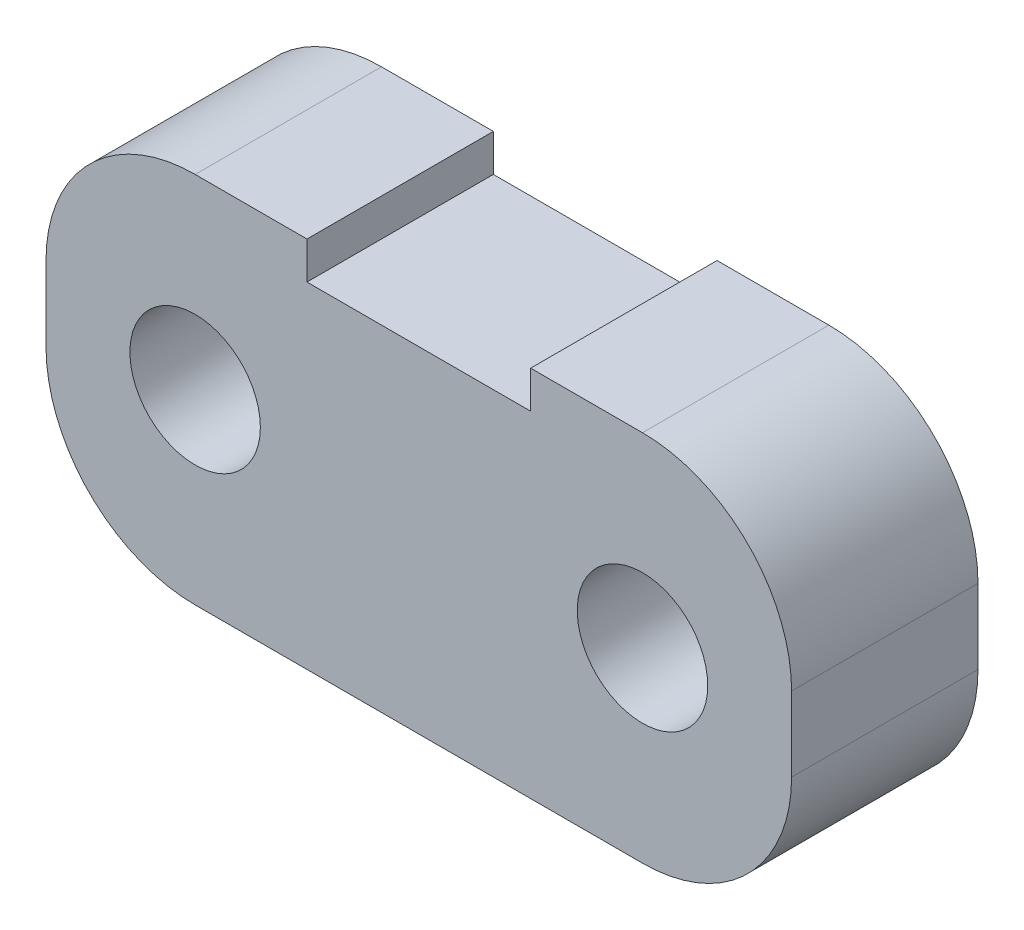
ISO-10303-21;
HEADER;
FILE_DESCRIPTION(('STEP AP214'),'2;1');
FILE_NAME('part.step','',(''),(''),'','','');
FILE_SCHEMA(('AUTOMOTIVE_DESIGN { 1 0 10303 214 1 1 1 1 }'));
ENDSEC;
DATA;
#1=APPLICATION_CONTEXT('core data for automotive mechanical design processes');
#2=APPLICATION_PROTOCOL_DEFINITION('international standard','automotive_design',2000,#1);
#3=PRODUCT_CONTEXT('',#1,'mechanical');
#4=PRODUCT('Part','Part','',(#3));
#5=PRODUCT_RELATED_PRODUCT_CATEGORY('part','',(#4));
#6=PRODUCT_DEFINITION_FORMATION('','',#4);
#7=PRODUCT_DEFINITION_CONTEXT('part definition',#1,'design');
#8=PRODUCT_DEFINITION('design','',#6,#7);
#9=PRODUCT_DEFINITION_SHAPE('','',#8);
#10=(LENGTH_UNIT() NAMED_UNIT(*) SI_UNIT(.MILLI.,.METRE.));
#11=(NAMED_UNIT(*) PLANE_ANGLE_UNIT() SI_UNIT($,.RADIAN.));
#12=(NAMED_UNIT(*) SI_UNIT($,.STERADIAN.) SOLID_ANGLE_UNIT());
#13=UNCERTAINTY_MEASURE_WITH_UNIT(LENGTH_MEASURE(1.E-05),#10,'distance_accuracy_value','');
#14=(GEOMETRIC_REPRESENTATION_CONTEXT(3) GLOBAL_UNCERTAINTY_ASSIGNED_CONTEXT((#13)) GLOBAL_UNIT_ASSIGNED_CONTEXT((#10,
#11,#12)) REPRESENTATION_CONTEXT('',''));
#15=CARTESIAN_POINT('',(0.,0.,0.));
#16=DIRECTION('',(0.,0.,1.));
#17=DIRECTION('',(1.,0.,0.));
#18=AXIS2_PLACEMENT_3D('',#15,#16,#17);
#19=CARTESIAN_POINT('',(6.,1.,0.));
#20=DIRECTION('',(0.,0.,-1.));
#21=DIRECTION('',(-1.,0.,0.));
#22=AXIS2_PLACEMENT_3D('',#19,#20,#21);
#23=PLANE('',#22);
#24=CARTESIAN_POINT('',(6.,0.,0.));
#25=DIRECTION('',(0.,0.,1.));
#26=DIRECTION('',(1.,0.,0.));
#27=AXIS2_PLACEMENT_3D('',#24,#25,#26);
#28=CIRCLE('',#27,1.75);
#29=CARTESIAN_POINT('',(7.75,0.,0.));
#30=VERTEX_POINT('',#29);
#31=EDGE_CURVE('E402',#30,#30,#28,.T.);
#32=ORIENTED_EDGE('',*,*,#31,.T.);
#33=EDGE_LOOP('',(#32));
#34=FACE_BOUND('',#33,.T.);
#35=CARTESIAN_POINT('',(6.,1.,0.));
#36=DIRECTION('',(0.,0.,1.));
#37=DIRECTION('',(-1.,0.,0.));
#38=AXIS2_PLACEMENT_3D('',#35,#36,#37);
#39=CIRCLE('',#38,4.);
#40=CARTESIAN_POINT('',(10.,1.,0.));
#41=VERTEX_POINT('',#40);
#42=CARTESIAN_POINT('',(6.,5.,0.));
#43=VERTEX_POINT('',#42);
#44=EDGE_CURVE('E249',#41,#43,#39,.T.);
#45=ORIENTED_EDGE('',*,*,#44,.F.);
#46=DIRECTION('',(0.,1.,0.));
#47=VECTOR('',#46,1.);
#48=CARTESIAN_POINT('',(10.,1.,0.));
#49=LINE('',#48,#47);
#50=CARTESIAN_POINT('',(10.,-1.,0.));
#51=VERTEX_POINT('',#50);
#52=EDGE_CURVE('E245',#51,#41,#49,.T.);
#53=ORIENTED_EDGE('',*,*,#52,.F.);
#54=CARTESIAN_POINT('',(6.,-1.,0.));
#55=DIRECTION('',(0.,0.,1.));
#56=DIRECTION('',(-1.,0.,0.));
#57=AXIS2_PLACEMENT_3D('',#54,#55,#56);
#58=CIRCLE('',#57,4.);
#59=CARTESIAN_POINT('',(6.,-5.,0.));
#60=VERTEX_POINT('',#59);
#61=EDGE_CURVE('E448',#60,#51,#58,.T.);
#62=ORIENTED_EDGE('',*,*,#61,.F.);
#63=DIRECTION('',(1.,0.,0.));
#64=VECTOR('',#63,1.);
#65=CARTESIAN_POINT('',(-6.,-5.,0.));
#66=LINE('',#65,#64);
#67=CARTESIAN_POINT('',(-6.,-5.,0.));
#68=VERTEX_POINT('',#67);
#69=EDGE_CURVE('E446',#68,#60,#66,.T.);
#70=ORIENTED_EDGE('',*,*,#69,.F.);
#71=CARTESIAN_POINT('',(-6.,-1.,0.));
#72=DIRECTION('',(0.,0.,1.));
#73=DIRECTION('',(-1.,0.,0.));
#74=AXIS2_PLACEMENT_3D('',#71,#72,#73);
#75=CIRCLE('',#74,4.);
#76=CARTESIAN_POINT('',(-10.,-1.,0.));
#77=VERTEX_POINT('',#76);
#78=EDGE_CURVE('E444',#77,#68,#75,.T.);
#79=ORIENTED_EDGE('',*,*,#78,.F.);
#80=DIRECTION('',(0.,-1.,0.));
#81=VECTOR('',#80,1.);
#82=CARTESIAN_POINT('',(-10.,1.,0.));
#83=LINE('',#82,#81);
#84=CARTESIAN_POINT('',(-10.,1.,0.));
#85=VERTEX_POINT('',#84);
#86=EDGE_CURVE('E442',#85,#77,#83,.T.);
#87=ORIENTED_EDGE('',*,*,#86,.F.);
#88=CARTESIAN_POINT('',(-6.,1.,0.));
#89=DIRECTION('',(0.,0.,1.));
#90=DIRECTION('',(-1.,0.,0.));
#91=AXIS2_PLACEMENT_3D('',#88,#89,#90);
#92=CIRCLE('',#91,4.);
#93=CARTESIAN_POINT('',(-6.,5.,0.));
#94=VERTEX_POINT('',#93);
#95=EDGE_CURVE('E440',#94,#85,#92,.T.);
#96=ORIENTED_EDGE('',*,*,#95,.F.);
#97=DIRECTION('',(-1.,0.,0.));
#98=VECTOR('',#97,1.);
#99=CARTESIAN_POINT('',(-6.,5.,0.));
#100=LINE('',#99,#98);
#101=CARTESIAN_POINT('',(-3.,5.,0.));
#102=VERTEX_POINT('',#101);
#103=EDGE_CURVE('E438',#102,#94,#100,.T.);
#104=ORIENTED_EDGE('',*,*,#103,.F.);
#105=DIRECTION('',(0.,1.,0.));
#106=VECTOR('',#105,1.);
#107=CARTESIAN_POINT('',(-3.,4.,0.));
#108=LINE('',#107,#106);
#109=CARTESIAN_POINT('',(-3.,4.,0.));
#110=VERTEX_POINT('',#109);
#111=EDGE_CURVE('E436',#110,#102,#108,.T.);
#112=ORIENTED_EDGE('',*,*,#111,.F.);
#113=DIRECTION('',(-1.,0.,0.));
#114=VECTOR('',#113,1.);
#115=CARTESIAN_POINT('',(-3.,4.,0.));
#116=LINE('',#115,#114);
#117=CARTESIAN_POINT('',(3.,4.,0.));
#118=VERTEX_POINT('',#117);
#119=EDGE_CURVE('E434',#118,#110,#116,.T.);
#120=ORIENTED_EDGE('',*,*,#119,.F.);
#121=DIRECTION('',(0.,-1.,0.));
#122=VECTOR('',#121,1.);
#123=CARTESIAN_POINT('',(3.,4.,0.));
#124=LINE('',#123,#122);
#125=CARTESIAN_POINT('',(3.,5.,0.));
#126=VERTEX_POINT('',#125);
#127=EDGE_CURVE('E432',#126,#118,#124,.T.);
#128=ORIENTED_EDGE('',*,*,#127,.F.);
#129=DIRECTION('',(-1.,0.,0.));
#130=VECTOR('',#129,1.);
#131=CARTESIAN_POINT('',(3.,5.,0.));
#132=LINE('',#131,#130);
#133=EDGE_CURVE('E430',#43,#126,#132,.T.);
#134=ORIENTED_EDGE('',*,*,#133,.F.);
#135=EDGE_LOOP('',(#45,#53,#62,#70,#79,#87,#96,#104,#112,#120,#128,#134));
#136=FACE_BOUND('',#135,.T.);
#137=CARTESIAN_POINT('',(-6.,0.,0.));
#138=DIRECTION('',(0.,0.,1.));
#139=DIRECTION('',(1.,0.,0.));
#140=AXIS2_PLACEMENT_3D('',#137,#138,#139);
#141=CIRCLE('',#140,1.75);
#142=CARTESIAN_POINT('',(-4.25,0.,0.));
#143=VERTEX_POINT('',#142);
#144=EDGE_CURVE('E398',#143,#143,#141,.T.);
#145=ORIENTED_EDGE('',*,*,#144,.T.);
#146=EDGE_LOOP('',(#145));
#147=FACE_BOUND('',#146,.T.);
#148=DIRECTION('',(0.,1.,0.));
#149=VECTOR('',#148,1.);
#150=CARTESIAN_POINT('',(-3.00000000000003,-3.,0.));
#151=LINE('',#150,#149);
#152=CARTESIAN_POINT('',(-3.00000000000005,-4.5,0.));
#153=VERTEX_POINT('',#152);
#154=CARTESIAN_POINT('',(-3.00000000000003,-2.5,0.));
#155=VERTEX_POINT('',#154);
#156=EDGE_CURVE('E377',#153,#155,#151,.T.);
#157=ORIENTED_EDGE('',*,*,#156,.F.);
#158=DIRECTION('',(-1.,0.,0.));
#159=VECTOR('',#158,1.);
#160=CARTESIAN_POINT('',(6.,-4.5,0.));
#161=LINE('',#160,#159);
#162=CARTESIAN_POINT('',(2.99999999999995,-4.5,0.));
#163=VERTEX_POINT('',#162);
#164=EDGE_CURVE('E253',#153,#163,#161,.F.);
#165=ORIENTED_EDGE('',*,*,#164,.T.);
#166=DIRECTION('',(0.,-1.,0.));
#167=VECTOR('',#166,1.);
#168=CARTESIAN_POINT('',(2.99999999999997,-3.,0.));
#169=LINE('',#168,#167);
#170=CARTESIAN_POINT('',(2.99999999999998,-2.5,0.));
#171=VERTEX_POINT('',#170);
#172=EDGE_CURVE('E372',#171,#163,#169,.T.);
#173=ORIENTED_EDGE('',*,*,#172,.F.);
#174=DIRECTION('',(0.,-1.,0.));
#175=VECTOR('',#174,1.);
#176=CARTESIAN_POINT('',(2.99999999999999,-1.,0.));
#177=LINE('',#176,#175);
#178=CARTESIAN_POINT('',(3.,-0.5,0.));
#179=VERTEX_POINT('',#178);
#180=EDGE_CURVE('E382',#179,#171,#177,.T.);
#181=ORIENTED_EDGE('',*,*,#180,.F.);
#182=DIRECTION('',(0.,-1.,0.));
#183=VECTOR('',#182,1.);
#184=CARTESIAN_POINT('',(3.,1.,0.));
#185=LINE('',#184,#183);
#186=CARTESIAN_POINT('',(3.,1.5,0.));
#187=VERTEX_POINT('',#186);
#188=EDGE_CURVE('E389',#187,#179,#185,.T.);
#189=ORIENTED_EDGE('',*,*,#188,.F.);
#190=DIRECTION('',(0.,-1.,0.));
#191=VECTOR('',#190,1.);
#192=CARTESIAN_POINT('',(3.,3.,0.));
#193=LINE('',#192,#191);
#194=CARTESIAN_POINT('',(3.,3.5,0.));
#195=VERTEX_POINT('',#194);
#196=EDGE_CURVE('E394',#195,#187,#193,.T.);
#197=ORIENTED_EDGE('',*,*,#196,.F.);
#198=DIRECTION('',(1.,0.,0.));
#199=VECTOR('',#198,1.);
#200=CARTESIAN_POINT('',(6.,3.5,0.));
#201=LINE('',#200,#199);
#202=CARTESIAN_POINT('',(-3.,3.5,0.));
#203=VERTEX_POINT('',#202);
#204=EDGE_CURVE('E250',#195,#203,#201,.F.);
#205=ORIENTED_EDGE('',*,*,#204,.T.);
#206=DIRECTION('',(0.,1.,0.));
#207=VECTOR('',#206,1.);
#208=CARTESIAN_POINT('',(-3.,3.,0.));
#209=LINE('',#208,#207);
#210=CARTESIAN_POINT('',(-3.,1.5,0.));
#211=VERTEX_POINT('',#210);
#212=EDGE_CURVE('E396',#211,#203,#209,.T.);
#213=ORIENTED_EDGE('',*,*,#212,.F.);
#214=DIRECTION('',(0.,1.,0.));
#215=VECTOR('',#214,1.);
#216=CARTESIAN_POINT('',(-3.,1.,0.));
#217=LINE('',#216,#215);
#218=CARTESIAN_POINT('',(-3.,-0.5,0.));
#219=VERTEX_POINT('',#218);
#220=EDGE_CURVE('E391',#219,#211,#217,.T.);
#221=ORIENTED_EDGE('',*,*,#220,.F.);
#222=DIRECTION('',(0.,1.,0.));
#223=VECTOR('',#222,1.);
#224=CARTESIAN_POINT('',(-3.00000000000001,-1.,0.));
#225=LINE('',#224,#223);
#226=EDGE_CURVE('E386',#155,#219,#225,.T.);
#227=ORIENTED_EDGE('',*,*,#226,.F.);
#228=EDGE_LOOP('',(#157,#165,#173,#181,#189,#197,#205,#213,#221,#227));
#229=FACE_BOUND('',#228,.T.);
#230=ADVANCED_FACE('F33',(#34,#136,#147,#229),#23,.T.);
#231=CARTESIAN_POINT('',(6.,1.,5.));
#232=DIRECTION('',(0.,0.,-1.));
#233=DIRECTION('',(-1.,0.,0.));
#234=AXIS2_PLACEMENT_3D('',#231,#232,#233);
#235=PLANE('',#234);
#236=CARTESIAN_POINT('',(6.,1.,5.));
#237=DIRECTION('',(0.,0.,1.));
#238=DIRECTION('',(-1.,0.,0.));
#239=AXIS2_PLACEMENT_3D('',#236,#237,#238);
#240=CIRCLE('',#239,4.);
#241=CARTESIAN_POINT('',(10.,1.,5.));
#242=VERTEX_POINT('',#241);
#243=CARTESIAN_POINT('',(6.,5.,5.));
#244=VERTEX_POINT('',#243);
#245=EDGE_CURVE('E235',#242,#244,#240,.T.);
#246=ORIENTED_EDGE('',*,*,#245,.T.);
#247=DIRECTION('',(-1.,0.,0.));
#248=VECTOR('',#247,1.);
#249=CARTESIAN_POINT('',(3.,5.,5.));
#250=LINE('',#249,#248);
#251=CARTESIAN_POINT('',(3.,5.,5.));
#252=VERTEX_POINT('',#251);
#253=EDGE_CURVE('E224',#244,#252,#250,.T.);
#254=ORIENTED_EDGE('',*,*,#253,.T.);
#255=DIRECTION('',(0.,-1.,0.));
#256=VECTOR('',#255,1.);
#257=CARTESIAN_POINT('',(3.,4.,5.));
#258=LINE('',#257,#256);
#259=CARTESIAN_POINT('',(3.,4.,5.));
#260=VERTEX_POINT('',#259);
#261=EDGE_CURVE('E234',#252,#260,#258,.T.);
#262=ORIENTED_EDGE('',*,*,#261,.T.);
#263=DIRECTION('',(-1.,0.,0.));
#264=VECTOR('',#263,1.);
#265=CARTESIAN_POINT('',(-3.,4.,5.));
#266=LINE('',#265,#264);
#267=CARTESIAN_POINT('',(-3.,4.,5.));
#268=VERTEX_POINT('',#267);
#269=EDGE_CURVE('E411',#260,#268,#266,.T.);
#270=ORIENTED_EDGE('',*,*,#269,.T.);
#271=DIRECTION('',(0.,1.,0.));
#272=VECTOR('',#271,1.);
#273=CARTESIAN_POINT('',(-3.,4.,5.));
#274=LINE('',#273,#272);
#275=CARTESIAN_POINT('',(-3.,5.,5.));
#276=VERTEX_POINT('',#275);
#277=EDGE_CURVE('E413',#268,#276,#274,.T.);
#278=ORIENTED_EDGE('',*,*,#277,.T.);
#279=DIRECTION('',(-1.,0.,0.));
#280=VECTOR('',#279,1.);
#281=CARTESIAN_POINT('',(-6.,5.,5.));
#282=LINE('',#281,#280);
#283=CARTESIAN_POINT('',(-6.,5.,5.));
#284=VERTEX_POINT('',#283);
#285=EDGE_CURVE('E415',#276,#284,#282,.T.);
#286=ORIENTED_EDGE('',*,*,#285,.T.);
#287=CARTESIAN_POINT('',(-6.,1.,5.));
#288=DIRECTION('',(0.,0.,1.));
#289=DIRECTION('',(-1.,0.,0.));
#290=AXIS2_PLACEMENT_3D('',#287,#288,#289);
#291=CIRCLE('',#290,4.);
#292=CARTESIAN_POINT('',(-10.,1.,5.));
#293=VERTEX_POINT('',#292);
#294=EDGE_CURVE('E417',#284,#293,#291,.T.);
#295=ORIENTED_EDGE('',*,*,#294,.T.);
#296=DIRECTION('',(0.,-1.,0.));
#297=VECTOR('',#296,1.);
#298=CARTESIAN_POINT('',(-10.,1.,5.));
#299=LINE('',#298,#297);
#300=CARTESIAN_POINT('',(-10.,-1.,5.));
#301=VERTEX_POINT('',#300);
#302=EDGE_CURVE('E419',#293,#301,#299,.T.);
#303=ORIENTED_EDGE('',*,*,#302,.T.);
#304=CARTESIAN_POINT('',(-6.,-1.,5.));
#305=DIRECTION('',(0.,0.,1.));
#306=DIRECTION('',(-1.,0.,0.));
#307=AXIS2_PLACEMENT_3D('',#304,#305,#306);
#308=CIRCLE('',#307,4.);
#309=CARTESIAN_POINT('',(-6.,-5.,5.));
#310=VERTEX_POINT('',#309);
#311=EDGE_CURVE('E421',#301,#310,#308,.T.);
#312=ORIENTED_EDGE('',*,*,#311,.T.);
#313=DIRECTION('',(1.,0.,0.));
#314=VECTOR('',#313,1.);
#315=CARTESIAN_POINT('',(-6.,-5.,5.));
#316=LINE('',#315,#314);
#317=CARTESIAN_POINT('',(6.,-5.,5.));
#318=VERTEX_POINT('',#317);
#319=EDGE_CURVE('E423',#310,#318,#316,.T.);
#320=ORIENTED_EDGE('',*,*,#319,.T.);
#321=CARTESIAN_POINT('',(6.,-1.,5.));
#322=DIRECTION('',(0.,0.,1.));
#323=DIRECTION('',(-1.,0.,0.));
#324=AXIS2_PLACEMENT_3D('',#321,#322,#323);
#325=CIRCLE('',#324,4.);
#326=CARTESIAN_POINT('',(10.,-1.,5.));
#327=VERTEX_POINT('',#326);
#328=EDGE_CURVE('E425',#318,#327,#325,.T.);
#329=ORIENTED_EDGE('',*,*,#328,.T.);
#330=DIRECTION('',(0.,1.,0.));
#331=VECTOR('',#330,1.);
#332=CARTESIAN_POINT('',(10.,1.,5.));
#333=LINE('',#332,#331);
#334=EDGE_CURVE('E241',#327,#242,#333,.T.);
#335=ORIENTED_EDGE('',*,*,#334,.T.);
#336=EDGE_LOOP('',(#246,#254,#262,#270,#278,#286,#295,#303,#312,#320,#329,#335));
#337=FACE_BOUND('',#336,.T.);
#338=CARTESIAN_POINT('',(6.,0.,5.));
#339=DIRECTION('',(0.,0.,1.));
#340=DIRECTION('',(1.,0.,0.));
#341=AXIS2_PLACEMENT_3D('',#338,#339,#340);
#342=CIRCLE('',#341,1.75);
#343=CARTESIAN_POINT('',(7.75,0.,5.));
#344=VERTEX_POINT('',#343);
#345=EDGE_CURVE('E405',#344,#344,#342,.T.);
#346=ORIENTED_EDGE('',*,*,#345,.F.);
#347=EDGE_LOOP('',(#346));
#348=FACE_BOUND('',#347,.T.);
#349=CARTESIAN_POINT('',(-6.,0.,5.));
#350=DIRECTION('',(0.,0.,1.));
#351=DIRECTION('',(1.,0.,0.));
#352=AXIS2_PLACEMENT_3D('',#349,#350,#351);
#353=CIRCLE('',#352,1.75);
#354=CARTESIAN_POINT('',(-4.25,0.,5.));
#355=VERTEX_POINT('',#354);
#356=EDGE_CURVE('E399',#355,#355,#353,.T.);
#357=ORIENTED_EDGE('',*,*,#356,.F.);
#358=EDGE_LOOP('',(#357));
#359=FACE_BOUND('',#358,.T.);
#360=ADVANCED_FACE('F238',(#337,#348,#359),#235,.F.);
#361=CARTESIAN_POINT('',(6.,1.,5.));
#362=DIRECTION('',(0.,0.,-1.));
#363=DIRECTION('',(-1.,0.,0.));
#364=AXIS2_PLACEMENT_3D('',#361,#362,#363);
#365=CYLINDRICAL_SURFACE('',#364,4.);
#366=ORIENTED_EDGE('',*,*,#44,.T.);
#367=DIRECTION('',(0.,0.,-1.));
#368=VECTOR('',#367,1.);
#369=CARTESIAN_POINT('',(6.,5.,5.));
#370=LINE('',#369,#368);
#371=EDGE_CURVE('E228',#244,#43,#370,.T.);
#372=ORIENTED_EDGE('',*,*,#371,.F.);
#373=ORIENTED_EDGE('',*,*,#245,.F.);
#374=DIRECTION('',(0.,0.,-1.));
#375=VECTOR('',#374,1.);
#376=CARTESIAN_POINT('',(10.,1.,5.));
#377=LINE('',#376,#375);
#378=EDGE_CURVE('E428',#242,#41,#377,.T.);
#379=ORIENTED_EDGE('',*,*,#378,.T.);
#380=EDGE_LOOP('',(#366,#372,#373,#379));
#381=FACE_BOUND('',#380,.T.);
#382=ADVANCED_FACE('F247',(#381),#365,.T.);
#383=CARTESIAN_POINT('',(3.,5.,5.));
#384=DIRECTION('',(0.,-1.,0.));
#385=DIRECTION('',(1.,0.,0.));
#386=AXIS2_PLACEMENT_3D('',#383,#384,#385);
#387=PLANE('',#386);
#388=ORIENTED_EDGE('',*,*,#133,.T.);
#389=DIRECTION('',(0.,0.,-1.));
#390=VECTOR('',#389,1.);
#391=CARTESIAN_POINT('',(3.,5.,5.));
#392=LINE('',#391,#390);
#393=EDGE_CURVE('E231',#252,#126,#392,.T.);
#394=ORIENTED_EDGE('',*,*,#393,.F.);
#395=ORIENTED_EDGE('',*,*,#253,.F.);
#396=ORIENTED_EDGE('',*,*,#371,.T.);
#397=EDGE_LOOP('',(#388,#394,#395,#396));
#398=FACE_BOUND('',#397,.T.);
#399=ADVANCED_FACE('F226',(#398),#387,.F.);
#400=CARTESIAN_POINT('',(3.,4.,5.));
#401=DIRECTION('',(1.,0.,0.));
#402=DIRECTION('',(0.,0.,-1.));
#403=AXIS2_PLACEMENT_3D('',#400,#401,#402);
#404=PLANE('',#403);
#405=ORIENTED_EDGE('',*,*,#127,.T.);
#406=DIRECTION('',(0.,0.,-1.));
#407=VECTOR('',#406,1.);
#408=CARTESIAN_POINT('',(3.,4.,5.));
#409=LINE('',#408,#407);
#410=EDGE_CURVE('E255',#260,#118,#409,.T.);
#411=ORIENTED_EDGE('',*,*,#410,.F.);
#412=ORIENTED_EDGE('',*,*,#261,.F.);
#413=ORIENTED_EDGE('',*,*,#393,.T.);
#414=EDGE_LOOP('',(#405,#411,#412,#413));
#415=FACE_BOUND('',#414,.T.);
#416=ADVANCED_FACE('F499',(#415),#404,.F.);
#417=CARTESIAN_POINT('',(-3.,4.,5.));
#418=DIRECTION('',(0.,-1.,0.));
#419=DIRECTION('',(0.,0.,-1.));
#420=AXIS2_PLACEMENT_3D('',#417,#418,#419);
#421=PLANE('',#420);
#422=ORIENTED_EDGE('',*,*,#119,.T.);
#423=DIRECTION('',(0.,0.,-1.));
#424=VECTOR('',#423,1.);
#425=CARTESIAN_POINT('',(-3.,4.,5.));
#426=LINE('',#425,#424);
#427=EDGE_CURVE('E473',#268,#110,#426,.T.);
#428=ORIENTED_EDGE('',*,*,#427,.F.);
#429=ORIENTED_EDGE('',*,*,#269,.F.);
#430=ORIENTED_EDGE('',*,*,#410,.T.);
#431=EDGE_LOOP('',(#422,#428,#429,#430));
#432=FACE_BOUND('',#431,.T.);
#433=ADVANCED_FACE('F480',(#432),#421,.F.);
#434=CARTESIAN_POINT('',(-3.,4.,5.));
#435=DIRECTION('',(-1.,0.,0.));
#436=DIRECTION('',(0.,0.,1.));
#437=AXIS2_PLACEMENT_3D('',#434,#435,#436);
#438=PLANE('',#437);
#439=ORIENTED_EDGE('',*,*,#111,.T.);
#440=DIRECTION('',(0.,0.,-1.));
#441=VECTOR('',#440,1.);
#442=CARTESIAN_POINT('',(-3.,5.,5.));
#443=LINE('',#442,#441);
#444=EDGE_CURVE('E470',#276,#102,#443,.T.);
#445=ORIENTED_EDGE('',*,*,#444,.F.);
#446=ORIENTED_EDGE('',*,*,#277,.F.);
#447=ORIENTED_EDGE('',*,*,#427,.T.);
#448=EDGE_LOOP('',(#439,#445,#446,#447));
#449=FACE_BOUND('',#448,.T.);
#450=ADVANCED_FACE('F491',(#449),#438,.F.);
#451=CARTESIAN_POINT('',(-6.,5.,5.));
#452=DIRECTION('',(0.,-1.,0.));
#453=DIRECTION('',(1.,0.,0.));
#454=AXIS2_PLACEMENT_3D('',#451,#452,#453);
#455=PLANE('',#454);
#456=ORIENTED_EDGE('',*,*,#103,.T.);
#457=DIRECTION('',(0.,0.,-1.));
#458=VECTOR('',#457,1.);
#459=CARTESIAN_POINT('',(-6.,5.,5.));
#460=LINE('',#459,#458);
#461=EDGE_CURVE('E467',#284,#94,#460,.T.);
#462=ORIENTED_EDGE('',*,*,#461,.F.);
#463=ORIENTED_EDGE('',*,*,#285,.F.);
#464=ORIENTED_EDGE('',*,*,#444,.T.);
#465=EDGE_LOOP('',(#456,#462,#463,#464));
#466=FACE_BOUND('',#465,.T.);
#467=ADVANCED_FACE('F495',(#466),#455,.F.);
#468=CARTESIAN_POINT('',(-6.,1.,5.));
#469=DIRECTION('',(0.,0.,-1.));
#470=DIRECTION('',(-1.,0.,0.));
#471=AXIS2_PLACEMENT_3D('',#468,#469,#470);
#472=CYLINDRICAL_SURFACE('',#471,4.);
#473=ORIENTED_EDGE('',*,*,#95,.T.);
#474=DIRECTION('',(0.,0.,-1.));
#475=VECTOR('',#474,1.);
#476=CARTESIAN_POINT('',(-10.,1.,5.));
#477=LINE('',#476,#475);
#478=EDGE_CURVE('E464',#293,#85,#477,.T.);
#479=ORIENTED_EDGE('',*,*,#478,.F.);
#480=ORIENTED_EDGE('',*,*,#294,.F.);
#481=ORIENTED_EDGE('',*,*,#461,.T.);
#482=EDGE_LOOP('',(#473,#479,#480,#481));
#483=FACE_BOUND('',#482,.T.);
#484=ADVANCED_FACE('F537',(#483),#472,.T.);
#485=CARTESIAN_POINT('',(-10.,1.,5.));
#486=DIRECTION('',(1.,0.,0.));
#487=DIRECTION('',(0.,0.,-1.));
#488=AXIS2_PLACEMENT_3D('',#485,#486,#487);
#489=PLANE('',#488);
#490=ORIENTED_EDGE('',*,*,#86,.T.);
#491=DIRECTION('',(0.,0.,-1.));
#492=VECTOR('',#491,1.);
#493=CARTESIAN_POINT('',(-10.,-1.,5.));
#494=LINE('',#493,#492);
#495=EDGE_CURVE('E461',#301,#77,#494,.T.);
#496=ORIENTED_EDGE('',*,*,#495,.F.);
#497=ORIENTED_EDGE('',*,*,#302,.F.);
#498=ORIENTED_EDGE('',*,*,#478,.T.);
#499=EDGE_LOOP('',(#490,#496,#497,#498));
#500=FACE_BOUND('',#499,.T.);
#501=ADVANCED_FACE('F533',(#500),#489,.F.);
#502=CARTESIAN_POINT('',(-6.,-1.,5.));
#503=DIRECTION('',(0.,0.,-1.));
#504=DIRECTION('',(-1.,0.,0.));
#505=AXIS2_PLACEMENT_3D('',#502,#503,#504);
#506=CYLINDRICAL_SURFACE('',#505,4.);
#507=ORIENTED_EDGE('',*,*,#78,.T.);
#508=DIRECTION('',(0.,0.,-1.));
#509=VECTOR('',#508,1.);
#510=CARTESIAN_POINT('',(-6.,-5.,5.));
#511=LINE('',#510,#509);
#512=EDGE_CURVE('E458',#310,#68,#511,.T.);
#513=ORIENTED_EDGE('',*,*,#512,.F.);
#514=ORIENTED_EDGE('',*,*,#311,.F.);
#515=ORIENTED_EDGE('',*,*,#495,.T.);
#516=EDGE_LOOP('',(#507,#513,#514,#515));
#517=FACE_BOUND('',#516,.T.);
#518=ADVANCED_FACE('F529',(#517),#506,.T.);
#519=CARTESIAN_POINT('',(-6.,-5.,5.));
#520=DIRECTION('',(0.,1.,0.));
#521=DIRECTION('',(0.,0.,1.));
#522=AXIS2_PLACEMENT_3D('',#519,#520,#521);
#523=PLANE('',#522);
#524=ORIENTED_EDGE('',*,*,#69,.T.);
#525=DIRECTION('',(0.,0.,-1.));
#526=VECTOR('',#525,1.);
#527=CARTESIAN_POINT('',(6.,-5.,5.));
#528=LINE('',#527,#526);
#529=EDGE_CURVE('E455',#318,#60,#528,.T.);
#530=ORIENTED_EDGE('',*,*,#529,.F.);
#531=ORIENTED_EDGE('',*,*,#319,.F.);
#532=ORIENTED_EDGE('',*,*,#512,.T.);
#533=EDGE_LOOP('',(#524,#530,#531,#532));
#534=FACE_BOUND('',#533,.T.);
#535=ADVANCED_FACE('F525',(#534),#523,.F.);
#536=CARTESIAN_POINT('',(6.,-1.,5.));
#537=DIRECTION('',(0.,0.,-1.));
#538=DIRECTION('',(-1.,0.,0.));
#539=AXIS2_PLACEMENT_3D('',#536,#537,#538);
#540=CYLINDRICAL_SURFACE('',#539,4.);
#541=ORIENTED_EDGE('',*,*,#61,.T.);
#542=DIRECTION('',(0.,0.,-1.));
#543=VECTOR('',#542,1.);
#544=CARTESIAN_POINT('',(10.,-1.,5.));
#545=LINE('',#544,#543);
#546=EDGE_CURVE('E452',#327,#51,#545,.T.);
#547=ORIENTED_EDGE('',*,*,#546,.F.);
#548=ORIENTED_EDGE('',*,*,#328,.F.);
#549=ORIENTED_EDGE('',*,*,#529,.T.);
#550=EDGE_LOOP('',(#541,#547,#548,#549));
#551=FACE_BOUND('',#550,.T.);
#552=ADVANCED_FACE('F521',(#551),#540,.T.);
#553=CARTESIAN_POINT('',(10.,1.,5.));
#554=DIRECTION('',(-1.,0.,0.));
#555=DIRECTION('',(0.,-1.,0.));
#556=AXIS2_PLACEMENT_3D('',#553,#554,#555);
#557=PLANE('',#556);
#558=ORIENTED_EDGE('',*,*,#52,.T.);
#559=ORIENTED_EDGE('',*,*,#378,.F.);
#560=ORIENTED_EDGE('',*,*,#334,.F.);
#561=ORIENTED_EDGE('',*,*,#546,.T.);
#562=EDGE_LOOP('',(#558,#559,#560,#561));
#563=FACE_BOUND('',#562,.T.);
#564=ADVANCED_FACE('F517',(#563),#557,.F.);
#565=CARTESIAN_POINT('',(6.,0.,5.));
#566=DIRECTION('',(0.,0.,-1.));
#567=DIRECTION('',(-1.,0.,0.));
#568=AXIS2_PLACEMENT_3D('',#565,#566,#567);
#569=CYLINDRICAL_SURFACE('',#568,1.75);
#570=ORIENTED_EDGE('',*,*,#345,.T.);
#571=EDGE_LOOP('',(#570));
#572=FACE_BOUND('',#571,.T.);
#573=ORIENTED_EDGE('',*,*,#31,.F.);
#574=EDGE_LOOP('',(#573));
#575=FACE_BOUND('',#574,.T.);
#576=ADVANCED_FACE('F520',(#572,#575),#569,.F.);
#577=CARTESIAN_POINT('',(-6.,0.,5.));
#578=DIRECTION('',(0.,0.,-1.));
#579=DIRECTION('',(-1.,0.,0.));
#580=AXIS2_PLACEMENT_3D('',#577,#578,#579);
#581=CYLINDRICAL_SURFACE('',#580,1.75);
#582=ORIENTED_EDGE('',*,*,#356,.T.);
#583=EDGE_LOOP('',(#582));
#584=FACE_BOUND('',#583,.T.);
#585=ORIENTED_EDGE('',*,*,#144,.F.);
#586=EDGE_LOOP('',(#585));
#587=FACE_BOUND('',#586,.T.);
#588=ADVANCED_FACE('F583',(#584,#587),#581,.F.);
#589=CARTESIAN_POINT('',(3.,3.,-1.));
#590=DIRECTION('',(-1.,0.,0.));
#591=DIRECTION('',(0.,-1.,0.));
#592=AXIS2_PLACEMENT_3D('',#589,#590,#591);
#593=PLANE('',#592);
#594=ORIENTED_EDGE('',*,*,#196,.T.);
#595=CARTESIAN_POINT('',(3.,1.5,-0.5));
#596=DIRECTION('',(-1.,0.,0.));
#597=DIRECTION('',(0.,-1.,0.));
#598=AXIS2_PLACEMENT_3D('',#595,#596,#597);
#599=CIRCLE('',#598,0.5);
#600=CARTESIAN_POINT('',(3.,2.,-0.5));
#601=VERTEX_POINT('',#600);
#602=EDGE_CURVE('E324',#187,#601,#599,.T.);
#603=ORIENTED_EDGE('',*,*,#602,.T.);
#604=CARTESIAN_POINT('',(3.,2.5,-0.5));
#605=DIRECTION('',(-1.,0.,0.));
#606=DIRECTION('',(0.,-1.,0.));
#607=AXIS2_PLACEMENT_3D('',#604,#605,#606);
#608=CIRCLE('',#607,0.5);
#609=CARTESIAN_POINT('',(3.,2.5,-1.));
#610=VERTEX_POINT('',#609);
#611=EDGE_CURVE('E55',#601,#610,#608,.F.);
#612=ORIENTED_EDGE('',*,*,#611,.T.);
#613=CARTESIAN_POINT('',(3.,2.5,-0.5));
#614=DIRECTION('',(-1.,0.,0.));
#615=DIRECTION('',(0.,-1.,0.));
#616=AXIS2_PLACEMENT_3D('',#613,#614,#615);
#617=CIRCLE('',#616,0.5);
#618=CARTESIAN_POINT('',(3.,3.,-0.5));
#619=VERTEX_POINT('',#618);
#620=EDGE_CURVE('E50',#610,#619,#617,.F.);
#621=ORIENTED_EDGE('',*,*,#620,.T.);
#622=CARTESIAN_POINT('',(3.,3.5,-0.5));
#623=DIRECTION('',(-1.,0.,0.));
#624=DIRECTION('',(0.,-1.,0.));
#625=AXIS2_PLACEMENT_3D('',#622,#623,#624);
#626=CIRCLE('',#625,0.5);
#627=EDGE_CURVE('E42',#619,#195,#626,.T.);
#628=ORIENTED_EDGE('',*,*,#627,.T.);
#629=EDGE_LOOP('',(#594,#603,#612,#621,#628));
#630=FACE_BOUND('',#629,.T.);
#631=ADVANCED_FACE('F590',(#630),#593,.F.);
#632=CARTESIAN_POINT('',(-3.,3.,-1.));
#633=DIRECTION('',(1.,0.,0.));
#634=DIRECTION('',(0.,1.,0.));
#635=AXIS2_PLACEMENT_3D('',#632,#633,#634);
#636=PLANE('',#635);
#637=CARTESIAN_POINT('',(-3.,2.5,-0.5));
#638=DIRECTION('',(1.,0.,0.));
#639=DIRECTION('',(0.,1.,0.));
#640=AXIS2_PLACEMENT_3D('',#637,#638,#639);
#641=CIRCLE('',#640,0.5);
#642=CARTESIAN_POINT('',(-3.,3.,-0.5));
#643=VERTEX_POINT('',#642);
#644=CARTESIAN_POINT('',(-3.,2.5,-1.));
#645=VERTEX_POINT('',#644);
#646=EDGE_CURVE('E285',#643,#645,#641,.F.);
#647=ORIENTED_EDGE('',*,*,#646,.T.);
#648=CARTESIAN_POINT('',(-3.,2.5,-0.5));
#649=DIRECTION('',(1.,0.,0.));
#650=DIRECTION('',(0.,1.,0.));
#651=AXIS2_PLACEMENT_3D('',#648,#649,#650);
#652=CIRCLE('',#651,0.5);
#653=CARTESIAN_POINT('',(-3.,2.,-0.5));
#654=VERTEX_POINT('',#653);
#655=EDGE_CURVE('E287',#645,#654,#652,.F.);
#656=ORIENTED_EDGE('',*,*,#655,.T.);
#657=CARTESIAN_POINT('',(-3.,1.5,-0.5));
#658=DIRECTION('',(1.,0.,0.));
#659=DIRECTION('',(0.,1.,0.));
#660=AXIS2_PLACEMENT_3D('',#657,#658,#659);
#661=CIRCLE('',#660,0.5);
#662=EDGE_CURVE('E321',#654,#211,#661,.T.);
#663=ORIENTED_EDGE('',*,*,#662,.T.);
#664=ORIENTED_EDGE('',*,*,#212,.T.);
#665=CARTESIAN_POINT('',(-3.,3.5,-0.5));
#666=DIRECTION('',(1.,0.,0.));
#667=DIRECTION('',(0.,1.,0.));
#668=AXIS2_PLACEMENT_3D('',#665,#666,#667);
#669=CIRCLE('',#668,0.5);
#670=EDGE_CURVE('E11',#203,#643,#669,.T.);
#671=ORIENTED_EDGE('',*,*,#670,.T.);
#672=EDGE_LOOP('',(#647,#656,#663,#664,#671));
#673=FACE_BOUND('',#672,.T.);
#674=ADVANCED_FACE('F598',(#673),#636,.F.);
#675=CARTESIAN_POINT('',(3.,1.,-1.));
#676=DIRECTION('',(-1.,0.,0.));
#677=DIRECTION('',(0.,0.,1.));
#678=AXIS2_PLACEMENT_3D('',#675,#676,#677);
#679=PLANE('',#678);
#680=ORIENTED_EDGE('',*,*,#188,.T.);
#681=CARTESIAN_POINT('',(3.,-0.5,-0.5));
#682=DIRECTION('',(-1.,0.,0.));
#683=DIRECTION('',(0.,0.,1.));
#684=AXIS2_PLACEMENT_3D('',#681,#682,#683);
#685=CIRCLE('',#684,0.5);
#686=CARTESIAN_POINT('',(3.,0.,-0.5));
#687=VERTEX_POINT('',#686);
#688=EDGE_CURVE('E319',#179,#687,#685,.T.);
#689=ORIENTED_EDGE('',*,*,#688,.T.);
#690=CARTESIAN_POINT('',(3.,0.5,-0.5));
#691=DIRECTION('',(-1.,0.,0.));
#692=DIRECTION('',(0.,0.,1.));
#693=AXIS2_PLACEMENT_3D('',#690,#691,#692);
#694=CIRCLE('',#693,0.5);
#695=CARTESIAN_POINT('',(3.,0.5,-1.));
#696=VERTEX_POINT('',#695);
#697=EDGE_CURVE('E283',#687,#696,#694,.F.);
#698=ORIENTED_EDGE('',*,*,#697,.T.);
#699=CARTESIAN_POINT('',(3.,0.5,-0.5));
#700=DIRECTION('',(-1.,0.,0.));
#701=DIRECTION('',(0.,0.,1.));
#702=AXIS2_PLACEMENT_3D('',#699,#700,#701);
#703=CIRCLE('',#702,0.5);
#704=CARTESIAN_POINT('',(3.,1.,-0.5));
#705=VERTEX_POINT('',#704);
#706=EDGE_CURVE('E281',#696,#705,#703,.F.);
#707=ORIENTED_EDGE('',*,*,#706,.T.);
#708=CARTESIAN_POINT('',(3.,1.5,-0.5));
#709=DIRECTION('',(-1.,0.,0.));
#710=DIRECTION('',(0.,0.,1.));
#711=AXIS2_PLACEMENT_3D('',#708,#709,#710);
#712=CIRCLE('',#711,0.5);
#713=EDGE_CURVE('E291',#705,#187,#712,.T.);
#714=ORIENTED_EDGE('',*,*,#713,.T.);
#715=EDGE_LOOP('',(#680,#689,#698,#707,#714));
#716=FACE_BOUND('',#715,.T.);
#717=ADVANCED_FACE('F605',(#716),#679,.F.);
#718=CARTESIAN_POINT('',(-3.,1.,-1.));
#719=DIRECTION('',(1.,0.,0.));
#720=DIRECTION('',(0.,1.,0.));
#721=AXIS2_PLACEMENT_3D('',#718,#719,#720);
#722=PLANE('',#721);
#723=CARTESIAN_POINT('',(-3.,0.5,-0.5));
#724=DIRECTION('',(1.,0.,0.));
#725=DIRECTION('',(0.,1.,0.));
#726=AXIS2_PLACEMENT_3D('',#723,#724,#725);
#727=CIRCLE('',#726,0.5);
#728=CARTESIAN_POINT('',(-3.,1.,-0.5));
#729=VERTEX_POINT('',#728);
#730=CARTESIAN_POINT('',(-3.,0.5,-1.));
#731=VERTEX_POINT('',#730);
#732=EDGE_CURVE('E277',#729,#731,#727,.F.);
#733=ORIENTED_EDGE('',*,*,#732,.T.);
#734=CARTESIAN_POINT('',(-3.,0.5,-0.5));
#735=DIRECTION('',(1.,0.,0.));
#736=DIRECTION('',(0.,1.,0.));
#737=AXIS2_PLACEMENT_3D('',#734,#735,#736);
#738=CIRCLE('',#737,0.5);
#739=CARTESIAN_POINT('',(-3.,0.,-0.5));
#740=VERTEX_POINT('',#739);
#741=EDGE_CURVE('E279',#731,#740,#738,.F.);
#742=ORIENTED_EDGE('',*,*,#741,.T.);
#743=CARTESIAN_POINT('',(-3.,-0.5,-0.5));
#744=DIRECTION('',(1.,0.,0.));
#745=DIRECTION('',(0.,1.,0.));
#746=AXIS2_PLACEMENT_3D('',#743,#744,#745);
#747=CIRCLE('',#746,0.5);
#748=EDGE_CURVE('E316',#740,#219,#747,.T.);
#749=ORIENTED_EDGE('',*,*,#748,.T.);
#750=ORIENTED_EDGE('',*,*,#220,.T.);
#751=CARTESIAN_POINT('',(-3.,1.5,-0.5));
#752=DIRECTION('',(1.,0.,0.));
#753=DIRECTION('',(0.,1.,0.));
#754=AXIS2_PLACEMENT_3D('',#751,#752,#753);
#755=CIRCLE('',#754,0.5);
#756=EDGE_CURVE('E294',#211,#729,#755,.T.);
#757=ORIENTED_EDGE('',*,*,#756,.T.);
#758=EDGE_LOOP('',(#733,#742,#749,#750,#757));
#759=FACE_BOUND('',#758,.T.);
#760=ADVANCED_FACE('F613',(#759),#722,.F.);
#761=CARTESIAN_POINT('',(2.99999999999999,-1.,-1.));
#762=DIRECTION('',(-1.,0.,0.));
#763=DIRECTION('',(0.,-1.,0.));
#764=AXIS2_PLACEMENT_3D('',#761,#762,#763);
#765=PLANE('',#764);
#766=ORIENTED_EDGE('',*,*,#180,.T.);
#767=CARTESIAN_POINT('',(2.99999999999998,-2.5,-0.5));
#768=DIRECTION('',(-1.,0.,0.));
#769=DIRECTION('',(0.,-1.,0.));
#770=AXIS2_PLACEMENT_3D('',#767,#768,#769);
#771=CIRCLE('',#770,0.5);
#772=CARTESIAN_POINT('',(2.99999999999998,-2.,-0.5));
#773=VERTEX_POINT('',#772);
#774=EDGE_CURVE('E314',#171,#773,#771,.T.);
#775=ORIENTED_EDGE('',*,*,#774,.T.);
#776=CARTESIAN_POINT('',(2.99999999999999,-1.5,-0.5));
#777=DIRECTION('',(-1.,0.,0.));
#778=DIRECTION('',(0.,-1.,0.));
#779=AXIS2_PLACEMENT_3D('',#776,#777,#778);
#780=CIRCLE('',#779,0.5);
#781=CARTESIAN_POINT('',(2.99999999999999,-1.5,-1.));
#782=VERTEX_POINT('',#781);
#783=EDGE_CURVE('E275',#773,#782,#780,.F.);
#784=ORIENTED_EDGE('',*,*,#783,.T.);
#785=CARTESIAN_POINT('',(2.99999999999999,-1.5,-0.5));
#786=DIRECTION('',(-1.,0.,0.));
#787=DIRECTION('',(0.,-1.,0.));
#788=AXIS2_PLACEMENT_3D('',#785,#786,#787);
#789=CIRCLE('',#788,0.5);
#790=CARTESIAN_POINT('',(2.99999999999999,-1.,-0.5));
#791=VERTEX_POINT('',#790);
#792=EDGE_CURVE('E273',#782,#791,#789,.F.);
#793=ORIENTED_EDGE('',*,*,#792,.T.);
#794=CARTESIAN_POINT('',(3.,-0.5,-0.5));
#795=DIRECTION('',(-1.,0.,0.));
#796=DIRECTION('',(0.,-1.,0.));
#797=AXIS2_PLACEMENT_3D('',#794,#795,#796);
#798=CIRCLE('',#797,0.5);
#799=EDGE_CURVE('E296',#791,#179,#798,.T.);
#800=ORIENTED_EDGE('',*,*,#799,.T.);
#801=EDGE_LOOP('',(#766,#775,#784,#793,#800));
#802=FACE_BOUND('',#801,.T.);
#803=ADVANCED_FACE('F621',(#802),#765,.F.);
#804=CARTESIAN_POINT('',(-3.00000000000001,-1.,-1.));
#805=DIRECTION('',(1.,0.,0.));
#806=DIRECTION('',(0.,1.,0.));
#807=AXIS2_PLACEMENT_3D('',#804,#805,#806);
#808=PLANE('',#807);
#809=CARTESIAN_POINT('',(-3.00000000000002,-1.5,-0.5));
#810=DIRECTION('',(1.,0.,0.));
#811=DIRECTION('',(0.,1.,0.));
#812=AXIS2_PLACEMENT_3D('',#809,#810,#811);
#813=CIRCLE('',#812,0.5);
#814=CARTESIAN_POINT('',(-3.00000000000001,-1.,-0.5));
#815=VERTEX_POINT('',#814);
#816=CARTESIAN_POINT('',(-3.00000000000002,-1.5,-1.));
#817=VERTEX_POINT('',#816);
#818=EDGE_CURVE('E269',#815,#817,#813,.F.);
#819=ORIENTED_EDGE('',*,*,#818,.T.);
#820=CARTESIAN_POINT('',(-3.00000000000002,-1.5,-0.5));
#821=DIRECTION('',(1.,0.,0.));
#822=DIRECTION('',(0.,1.,0.));
#823=AXIS2_PLACEMENT_3D('',#820,#821,#822);
#824=CIRCLE('',#823,0.5);
#825=CARTESIAN_POINT('',(-3.00000000000002,-2.,-0.5));
#826=VERTEX_POINT('',#825);
#827=EDGE_CURVE('E271',#817,#826,#824,.F.);
#828=ORIENTED_EDGE('',*,*,#827,.T.);
#829=CARTESIAN_POINT('',(-3.00000000000003,-2.5,-0.5));
#830=DIRECTION('',(1.,0.,0.));
#831=DIRECTION('',(0.,1.,0.));
#832=AXIS2_PLACEMENT_3D('',#829,#830,#831);
#833=CIRCLE('',#832,0.5);
#834=EDGE_CURVE('E311',#826,#155,#833,.T.);
#835=ORIENTED_EDGE('',*,*,#834,.T.);
#836=ORIENTED_EDGE('',*,*,#226,.T.);
#837=CARTESIAN_POINT('',(-3.,-0.5,-0.5));
#838=DIRECTION('',(1.,0.,0.));
#839=DIRECTION('',(0.,1.,0.));
#840=AXIS2_PLACEMENT_3D('',#837,#838,#839);
#841=CIRCLE('',#840,0.5);
#842=EDGE_CURVE('E299',#219,#815,#841,.T.);
#843=ORIENTED_EDGE('',*,*,#842,.T.);
#844=EDGE_LOOP('',(#819,#828,#835,#836,#843));
#845=FACE_BOUND('',#844,.T.);
#846=ADVANCED_FACE('F629',(#845),#808,.F.);
#847=CARTESIAN_POINT('',(2.99999999999997,-3.,-1.));
#848=DIRECTION('',(-1.,0.,0.));
#849=DIRECTION('',(0.,-1.,0.));
#850=AXIS2_PLACEMENT_3D('',#847,#848,#849);
#851=PLANE('',#850);
#852=ORIENTED_EDGE('',*,*,#172,.T.);
#853=CARTESIAN_POINT('',(2.99999999999995,-4.5,-0.5));
#854=DIRECTION('',(-1.,0.,0.));
#855=DIRECTION('',(0.,-1.,0.));
#856=AXIS2_PLACEMENT_3D('',#853,#854,#855);
#857=CIRCLE('',#856,0.5);
#858=CARTESIAN_POINT('',(2.99999999999996,-4.,-0.5));
#859=VERTEX_POINT('',#858);
#860=EDGE_CURVE('E309',#163,#859,#857,.T.);
#861=ORIENTED_EDGE('',*,*,#860,.T.);
#862=CARTESIAN_POINT('',(2.99999999999996,-3.5,-0.5));
#863=DIRECTION('',(-1.,0.,0.));
#864=DIRECTION('',(0.,-1.,0.));
#865=AXIS2_PLACEMENT_3D('',#862,#863,#864);
#866=CIRCLE('',#865,0.5);
#867=CARTESIAN_POINT('',(2.99999999999996,-3.5,-1.));
#868=VERTEX_POINT('',#867);
#869=EDGE_CURVE('E267',#859,#868,#866,.F.);
#870=ORIENTED_EDGE('',*,*,#869,.T.);
#871=CARTESIAN_POINT('',(2.99999999999996,-3.5,-0.5));
#872=DIRECTION('',(-1.,0.,0.));
#873=DIRECTION('',(0.,-1.,0.));
#874=AXIS2_PLACEMENT_3D('',#871,#872,#873);
#875=CIRCLE('',#874,0.5);
#876=CARTESIAN_POINT('',(2.99999999999997,-3.,-0.5));
#877=VERTEX_POINT('',#876);
#878=EDGE_CURVE('E265',#868,#877,#875,.F.);
#879=ORIENTED_EDGE('',*,*,#878,.T.);
#880=CARTESIAN_POINT('',(2.99999999999998,-2.5,-0.5));
#881=DIRECTION('',(-1.,0.,0.));
#882=DIRECTION('',(0.,-1.,0.));
#883=AXIS2_PLACEMENT_3D('',#880,#881,#882);
#884=CIRCLE('',#883,0.5);
#885=EDGE_CURVE('E301',#877,#171,#884,.T.);
#886=ORIENTED_EDGE('',*,*,#885,.T.);
#887=EDGE_LOOP('',(#852,#861,#870,#879,#886));
#888=FACE_BOUND('',#887,.T.);
#889=ADVANCED_FACE('F637',(#888),#851,.F.);
#890=CARTESIAN_POINT('',(-3.00000000000003,-3.,-1.));
#891=DIRECTION('',(1.,0.,0.));
#892=DIRECTION('',(0.,1.,0.));
#893=AXIS2_PLACEMENT_3D('',#890,#891,#892);
#894=PLANE('',#893);
#895=CARTESIAN_POINT('',(-3.00000000000004,-3.5,-0.5));
#896=DIRECTION('',(1.,0.,0.));
#897=DIRECTION('',(0.,1.,0.));
#898=AXIS2_PLACEMENT_3D('',#895,#896,#897);
#899=CIRCLE('',#898,0.5);
#900=CARTESIAN_POINT('',(-3.00000000000003,-3.,-0.5));
#901=VERTEX_POINT('',#900);
#902=CARTESIAN_POINT('',(-3.00000000000004,-3.5,-1.));
#903=VERTEX_POINT('',#902);
#904=EDGE_CURVE('E261',#901,#903,#899,.F.);
#905=ORIENTED_EDGE('',*,*,#904,.T.);
#906=CARTESIAN_POINT('',(-3.00000000000004,-3.5,-0.5));
#907=DIRECTION('',(1.,0.,0.));
#908=DIRECTION('',(0.,1.,0.));
#909=AXIS2_PLACEMENT_3D('',#906,#907,#908);
#910=CIRCLE('',#909,0.5);
#911=CARTESIAN_POINT('',(-3.00000000000004,-4.,-0.5));
#912=VERTEX_POINT('',#911);
#913=EDGE_CURVE('E263',#903,#912,#910,.F.);
#914=ORIENTED_EDGE('',*,*,#913,.T.);
#915=CARTESIAN_POINT('',(-3.00000000000005,-4.5,-0.5));
#916=DIRECTION('',(1.,0.,0.));
#917=DIRECTION('',(0.,1.,0.));
#918=AXIS2_PLACEMENT_3D('',#915,#916,#917);
#919=CIRCLE('',#918,0.5);
#920=EDGE_CURVE('E306',#912,#153,#919,.T.);
#921=ORIENTED_EDGE('',*,*,#920,.T.);
#922=ORIENTED_EDGE('',*,*,#156,.T.);
#923=CARTESIAN_POINT('',(-3.00000000000003,-2.5,-0.5));
#924=DIRECTION('',(1.,0.,0.));
#925=DIRECTION('',(0.,1.,0.));
#926=AXIS2_PLACEMENT_3D('',#923,#924,#925);
#927=CIRCLE('',#926,0.5);
#928=EDGE_CURVE('E304',#155,#901,#927,.T.);
#929=ORIENTED_EDGE('',*,*,#928,.T.);
#930=EDGE_LOOP('',(#905,#914,#921,#922,#929));
#931=FACE_BOUND('',#930,.T.);
#932=ADVANCED_FACE('F645',(#931),#894,.F.);
#933=CARTESIAN_POINT('',(2.99999999999996,-4.5,-0.5));
#934=DIRECTION('',(-1.,0.,0.));
#935=DIRECTION('',(0.,0.,1.));
#936=AXIS2_PLACEMENT_3D('',#933,#934,#935);
#937=CYLINDRICAL_SURFACE('',#936,0.5);
#938=ORIENTED_EDGE('',*,*,#164,.F.);
#939=ORIENTED_EDGE('',*,*,#920,.F.);
#940=DIRECTION('',(-1.,0.,0.));
#941=VECTOR('',#940,1.);
#942=CARTESIAN_POINT('',(2.99999999999996,-4.,-0.5));
#943=LINE('',#942,#941);
#944=EDGE_CURVE('E37',#859,#912,#943,.T.);
#945=ORIENTED_EDGE('',*,*,#944,.F.);
#946=ORIENTED_EDGE('',*,*,#860,.F.);
#947=EDGE_LOOP('',(#938,#939,#945,#946));
#948=FACE_BOUND('',#947,.T.);
#949=ADVANCED_FACE('F35',(#948),#937,.F.);
#950=CARTESIAN_POINT('',(0.,-3.5,-0.5));
#951=DIRECTION('',(1.,0.,0.));
#952=DIRECTION('',(0.,0.,-1.));
#953=AXIS2_PLACEMENT_3D('',#950,#951,#952);
#954=CYLINDRICAL_SURFACE('',#953,0.5);
#955=ORIENTED_EDGE('',*,*,#944,.T.);
#956=ORIENTED_EDGE('',*,*,#913,.F.);
#957=DIRECTION('',(-1.,0.,0.));
#958=VECTOR('',#957,1.);
#959=CARTESIAN_POINT('',(-3.00000000000004,-3.5,-1.));
#960=LINE('',#959,#958);
#961=EDGE_CURVE('E365',#868,#903,#960,.T.);
#962=ORIENTED_EDGE('',*,*,#961,.F.);
#963=ORIENTED_EDGE('',*,*,#869,.F.);
#964=EDGE_LOOP('',(#955,#956,#962,#963));
#965=FACE_BOUND('',#964,.T.);
#966=ADVANCED_FACE('F659',(#965),#954,.T.);
#967=CARTESIAN_POINT('',(0.,-3.5,-0.5));
#968=DIRECTION('',(-1.,0.,0.));
#969=DIRECTION('',(0.,0.,1.));
#970=AXIS2_PLACEMENT_3D('',#967,#968,#969);
#971=CYLINDRICAL_SURFACE('',#970,0.5);
#972=ORIENTED_EDGE('',*,*,#961,.T.);
#973=ORIENTED_EDGE('',*,*,#904,.F.);
#974=DIRECTION('',(1.,0.,0.));
#975=VECTOR('',#974,1.);
#976=CARTESIAN_POINT('',(-3.00000000000003,-3.,-0.5));
#977=LINE('',#976,#975);
#978=EDGE_CURVE('E363',#877,#901,#977,.F.);
#979=ORIENTED_EDGE('',*,*,#978,.F.);
#980=ORIENTED_EDGE('',*,*,#878,.F.);
#981=EDGE_LOOP('',(#972,#973,#979,#980));
#982=FACE_BOUND('',#981,.T.);
#983=ADVANCED_FACE('F666',(#982),#971,.T.);
#984=CARTESIAN_POINT('',(2.99999999999997,-2.5,-0.5));
#985=DIRECTION('',(1.,0.,0.));
#986=DIRECTION('',(0.,0.,-1.));
#987=AXIS2_PLACEMENT_3D('',#984,#985,#986);
#988=CYLINDRICAL_SURFACE('',#987,0.5);
#989=ORIENTED_EDGE('',*,*,#978,.T.);
#990=ORIENTED_EDGE('',*,*,#928,.F.);
#991=DIRECTION('',(1.,0.,0.));
#992=VECTOR('',#991,1.);
#993=CARTESIAN_POINT('',(6.,-2.5,0.));
#994=LINE('',#993,#992);
#995=EDGE_CURVE('E360',#171,#155,#994,.F.);
#996=ORIENTED_EDGE('',*,*,#995,.F.);
#997=ORIENTED_EDGE('',*,*,#885,.F.);
#998=EDGE_LOOP('',(#989,#990,#996,#997));
#999=FACE_BOUND('',#998,.T.);
#1000=ADVANCED_FACE('F672',(#999),#988,.F.);
#1001=CARTESIAN_POINT('',(2.99999999999998,-2.5,-0.5));
#1002=DIRECTION('',(-1.,0.,0.));
#1003=DIRECTION('',(0.,0.,1.));
#1004=AXIS2_PLACEMENT_3D('',#1001,#1002,#1003);
#1005=CYLINDRICAL_SURFACE('',#1004,0.5);
#1006=ORIENTED_EDGE('',*,*,#995,.T.);
#1007=ORIENTED_EDGE('',*,*,#834,.F.);
#1008=DIRECTION('',(-1.,0.,0.));
#1009=VECTOR('',#1008,1.);
#1010=CARTESIAN_POINT('',(2.99999999999998,-2.,-0.5));
#1011=LINE('',#1010,#1009);
#1012=EDGE_CURVE('E357',#773,#826,#1011,.T.);
#1013=ORIENTED_EDGE('',*,*,#1012,.F.);
#1014=ORIENTED_EDGE('',*,*,#774,.F.);
#1015=EDGE_LOOP('',(#1006,#1007,#1013,#1014));
#1016=FACE_BOUND('',#1015,.T.);
#1017=ADVANCED_FACE('F679',(#1016),#1005,.F.);
#1018=CARTESIAN_POINT('',(0.,-1.5,-0.5));
#1019=DIRECTION('',(1.,0.,0.));
#1020=DIRECTION('',(0.,0.,-1.));
#1021=AXIS2_PLACEMENT_3D('',#1018,#1019,#1020);
#1022=CYLINDRICAL_SURFACE('',#1021,0.5);
#1023=ORIENTED_EDGE('',*,*,#1012,.T.);
#1024=ORIENTED_EDGE('',*,*,#827,.F.);
#1025=DIRECTION('',(-1.,0.,0.));
#1026=VECTOR('',#1025,1.);
#1027=CARTESIAN_POINT('',(-3.00000000000002,-1.5,-1.));
#1028=LINE('',#1027,#1026);
#1029=EDGE_CURVE('E354',#782,#817,#1028,.T.);
#1030=ORIENTED_EDGE('',*,*,#1029,.F.);
#1031=ORIENTED_EDGE('',*,*,#783,.F.);
#1032=EDGE_LOOP('',(#1023,#1024,#1030,#1031));
#1033=FACE_BOUND('',#1032,.T.);
#1034=ADVANCED_FACE('F687',(#1033),#1022,.T.);
#1035=CARTESIAN_POINT('',(0.,-1.5,-0.5));
#1036=DIRECTION('',(-1.,0.,0.));
#1037=DIRECTION('',(0.,0.,1.));
#1038=AXIS2_PLACEMENT_3D('',#1035,#1036,#1037);
#1039=CYLINDRICAL_SURFACE('',#1038,0.5);
#1040=ORIENTED_EDGE('',*,*,#1029,.T.);
#1041=ORIENTED_EDGE('',*,*,#818,.F.);
#1042=DIRECTION('',(1.,0.,0.));
#1043=VECTOR('',#1042,1.);
#1044=CARTESIAN_POINT('',(-3.00000000000001,-1.,-0.5));
#1045=LINE('',#1044,#1043);
#1046=EDGE_CURVE('E351',#791,#815,#1045,.F.);
#1047=ORIENTED_EDGE('',*,*,#1046,.F.);
#1048=ORIENTED_EDGE('',*,*,#792,.F.);
#1049=EDGE_LOOP('',(#1040,#1041,#1047,#1048));
#1050=FACE_BOUND('',#1049,.T.);
#1051=ADVANCED_FACE('F695',(#1050),#1039,.T.);
#1052=CARTESIAN_POINT('',(3.,3.5,-0.5));
#1053=DIRECTION('',(1.,0.,0.));
#1054=DIRECTION('',(0.,0.,-1.));
#1055=AXIS2_PLACEMENT_3D('',#1052,#1053,#1054);
#1056=CYLINDRICAL_SURFACE('',#1055,0.5);
#1057=ORIENTED_EDGE('',*,*,#204,.F.);
#1058=ORIENTED_EDGE('',*,*,#627,.F.);
#1059=DIRECTION('',(1.,0.,0.));
#1060=VECTOR('',#1059,1.);
#1061=CARTESIAN_POINT('',(3.,3.,-0.5));
#1062=LINE('',#1061,#1060);
#1063=EDGE_CURVE('E348',#643,#619,#1062,.T.);
#1064=ORIENTED_EDGE('',*,*,#1063,.F.);
#1065=ORIENTED_EDGE('',*,*,#670,.F.);
#1066=EDGE_LOOP('',(#1057,#1058,#1064,#1065));
#1067=FACE_BOUND('',#1066,.T.);
#1068=ADVANCED_FACE('F703',(#1067),#1056,.F.);
#1069=CARTESIAN_POINT('',(2.99999999999999,-0.5,-0.5));
#1070=DIRECTION('',(1.,0.,0.));
#1071=DIRECTION('',(0.,0.,-1.));
#1072=AXIS2_PLACEMENT_3D('',#1069,#1070,#1071);
#1073=CYLINDRICAL_SURFACE('',#1072,0.5);
#1074=ORIENTED_EDGE('',*,*,#1046,.T.);
#1075=ORIENTED_EDGE('',*,*,#842,.F.);
#1076=DIRECTION('',(1.,0.,0.));
#1077=VECTOR('',#1076,1.);
#1078=CARTESIAN_POINT('',(6.,-0.5,0.));
#1079=LINE('',#1078,#1077);
#1080=EDGE_CURVE('E345',#179,#219,#1079,.F.);
#1081=ORIENTED_EDGE('',*,*,#1080,.F.);
#1082=ORIENTED_EDGE('',*,*,#799,.F.);
#1083=EDGE_LOOP('',(#1074,#1075,#1081,#1082));
#1084=FACE_BOUND('',#1083,.T.);
#1085=ADVANCED_FACE('F711',(#1084),#1073,.F.);
#1086=CARTESIAN_POINT('',(0.,2.5,-0.5));
#1087=DIRECTION('',(-1.,0.,0.));
#1088=DIRECTION('',(0.,0.,1.));
#1089=AXIS2_PLACEMENT_3D('',#1086,#1087,#1088);
#1090=CYLINDRICAL_SURFACE('',#1089,0.5);
#1091=ORIENTED_EDGE('',*,*,#1063,.T.);
#1092=ORIENTED_EDGE('',*,*,#620,.F.);
#1093=DIRECTION('',(1.,0.,0.));
#1094=VECTOR('',#1093,1.);
#1095=CARTESIAN_POINT('',(3.,2.5,-1.));
#1096=LINE('',#1095,#1094);
#1097=EDGE_CURVE('E342',#645,#610,#1096,.T.);
#1098=ORIENTED_EDGE('',*,*,#1097,.F.);
#1099=ORIENTED_EDGE('',*,*,#646,.F.);
#1100=EDGE_LOOP('',(#1091,#1092,#1098,#1099));
#1101=FACE_BOUND('',#1100,.T.);
#1102=ADVANCED_FACE('F719',(#1101),#1090,.T.);
#1103=CARTESIAN_POINT('',(3.,-0.5,-0.5));
#1104=DIRECTION('',(-1.,0.,0.));
#1105=DIRECTION('',(0.,0.,1.));
#1106=AXIS2_PLACEMENT_3D('',#1103,#1104,#1105);
#1107=CYLINDRICAL_SURFACE('',#1106,0.5);
#1108=ORIENTED_EDGE('',*,*,#1080,.T.);
#1109=ORIENTED_EDGE('',*,*,#748,.F.);
#1110=DIRECTION('',(-1.,0.,0.));
#1111=VECTOR('',#1110,1.);
#1112=CARTESIAN_POINT('',(3.,0.,-0.5));
#1113=LINE('',#1112,#1111);
#1114=EDGE_CURVE('E339',#687,#740,#1113,.T.);
#1115=ORIENTED_EDGE('',*,*,#1114,.F.);
#1116=ORIENTED_EDGE('',*,*,#688,.F.);
#1117=EDGE_LOOP('',(#1108,#1109,#1115,#1116));
#1118=FACE_BOUND('',#1117,.T.);
#1119=ADVANCED_FACE('F727',(#1118),#1107,.F.);
#1120=CARTESIAN_POINT('',(0.,2.5,-0.5));
#1121=DIRECTION('',(1.,0.,0.));
#1122=DIRECTION('',(0.,0.,-1.));
#1123=AXIS2_PLACEMENT_3D('',#1120,#1121,#1122);
#1124=CYLINDRICAL_SURFACE('',#1123,0.5);
#1125=ORIENTED_EDGE('',*,*,#1097,.T.);
#1126=ORIENTED_EDGE('',*,*,#611,.F.);
#1127=DIRECTION('',(-1.,0.,0.));
#1128=VECTOR('',#1127,1.);
#1129=CARTESIAN_POINT('',(3.,2.,-0.5));
#1130=LINE('',#1129,#1128);
#1131=EDGE_CURVE('E336',#654,#601,#1130,.F.);
#1132=ORIENTED_EDGE('',*,*,#1131,.F.);
#1133=ORIENTED_EDGE('',*,*,#655,.F.);
#1134=EDGE_LOOP('',(#1125,#1126,#1132,#1133));
#1135=FACE_BOUND('',#1134,.T.);
#1136=ADVANCED_FACE('F735',(#1135),#1124,.T.);
#1137=CARTESIAN_POINT('',(0.,0.5,-0.5));
#1138=DIRECTION('',(1.,0.,0.));
#1139=DIRECTION('',(0.,0.,-1.));
#1140=AXIS2_PLACEMENT_3D('',#1137,#1138,#1139);
#1141=CYLINDRICAL_SURFACE('',#1140,0.5);
#1142=ORIENTED_EDGE('',*,*,#1114,.T.);
#1143=ORIENTED_EDGE('',*,*,#741,.F.);
#1144=DIRECTION('',(-1.,0.,0.));
#1145=VECTOR('',#1144,1.);
#1146=CARTESIAN_POINT('',(-3.,0.5,-1.));
#1147=LINE('',#1146,#1145);
#1148=EDGE_CURVE('E333',#696,#731,#1147,.T.);
#1149=ORIENTED_EDGE('',*,*,#1148,.F.);
#1150=ORIENTED_EDGE('',*,*,#697,.F.);
#1151=EDGE_LOOP('',(#1142,#1143,#1149,#1150));
#1152=FACE_BOUND('',#1151,.T.);
#1153=ADVANCED_FACE('F743',(#1152),#1141,.T.);
#1154=CARTESIAN_POINT('',(3.,1.5,-0.5));
#1155=DIRECTION('',(-1.,0.,0.));
#1156=DIRECTION('',(0.,0.,1.));
#1157=AXIS2_PLACEMENT_3D('',#1154,#1155,#1156);
#1158=CYLINDRICAL_SURFACE('',#1157,0.5);
#1159=ORIENTED_EDGE('',*,*,#1131,.T.);
#1160=ORIENTED_EDGE('',*,*,#602,.F.);
#1161=DIRECTION('',(-1.,0.,0.));
#1162=VECTOR('',#1161,1.);
#1163=CARTESIAN_POINT('',(6.,1.5,0.));
#1164=LINE('',#1163,#1162);
#1165=EDGE_CURVE('E330',#211,#187,#1164,.F.);
#1166=ORIENTED_EDGE('',*,*,#1165,.F.);
#1167=ORIENTED_EDGE('',*,*,#662,.F.);
#1168=EDGE_LOOP('',(#1159,#1160,#1166,#1167));
#1169=FACE_BOUND('',#1168,.T.);
#1170=ADVANCED_FACE('F751',(#1169),#1158,.F.);
#1171=CARTESIAN_POINT('',(0.,0.5,-0.5));
#1172=DIRECTION('',(-1.,0.,0.));
#1173=DIRECTION('',(0.,0.,1.));
#1174=AXIS2_PLACEMENT_3D('',#1171,#1172,#1173);
#1175=CYLINDRICAL_SURFACE('',#1174,0.5);
#1176=ORIENTED_EDGE('',*,*,#1148,.T.);
#1177=ORIENTED_EDGE('',*,*,#732,.F.);
#1178=DIRECTION('',(1.,0.,0.));
#1179=VECTOR('',#1178,1.);
#1180=CARTESIAN_POINT('',(-3.,1.,-0.5));
#1181=LINE('',#1180,#1179);
#1182=EDGE_CURVE('E327',#705,#729,#1181,.F.);
#1183=ORIENTED_EDGE('',*,*,#1182,.F.);
#1184=ORIENTED_EDGE('',*,*,#706,.F.);
#1185=EDGE_LOOP('',(#1176,#1177,#1183,#1184));
#1186=FACE_BOUND('',#1185,.T.);
#1187=ADVANCED_FACE('F759',(#1186),#1175,.T.);
#1188=CARTESIAN_POINT('',(3.,1.5,-0.5));
#1189=DIRECTION('',(1.,0.,0.));
#1190=DIRECTION('',(0.,0.,-1.));
#1191=AXIS2_PLACEMENT_3D('',#1188,#1189,#1190);
#1192=CYLINDRICAL_SURFACE('',#1191,0.5);
#1193=ORIENTED_EDGE('',*,*,#756,.F.);
#1194=ORIENTED_EDGE('',*,*,#1165,.T.);
#1195=ORIENTED_EDGE('',*,*,#713,.F.);
#1196=ORIENTED_EDGE('',*,*,#1182,.T.);
#1197=EDGE_LOOP('',(#1193,#1194,#1195,#1196));
#1198=FACE_BOUND('',#1197,.T.);
#1199=ADVANCED_FACE('F767',(#1198),#1192,.F.);
#1200=CLOSED_SHELL('',(#230,#360,#382,#399,#416,#433,#450,#467,#484,#501,#518,#535,#552,#564,
#576,#588,#631,#674,#717,#760,#803,#846,#889,#932,#949,#966,#983,#1000,#1017,#1034,#1051,#1068,
#1085,#1102,#1119,#1136,#1153,#1170,#1187,#1199));
#1201=MANIFOLD_SOLID_BREP('B2',#1200);
#1202=ADVANCED_BREP_SHAPE_REPRESENTATION('',(#18,#1201),#14);
#1203=SHAPE_DEFINITION_REPRESENTATION(#9,#1202);
ENDSEC;
END-ISO-10303-21;
